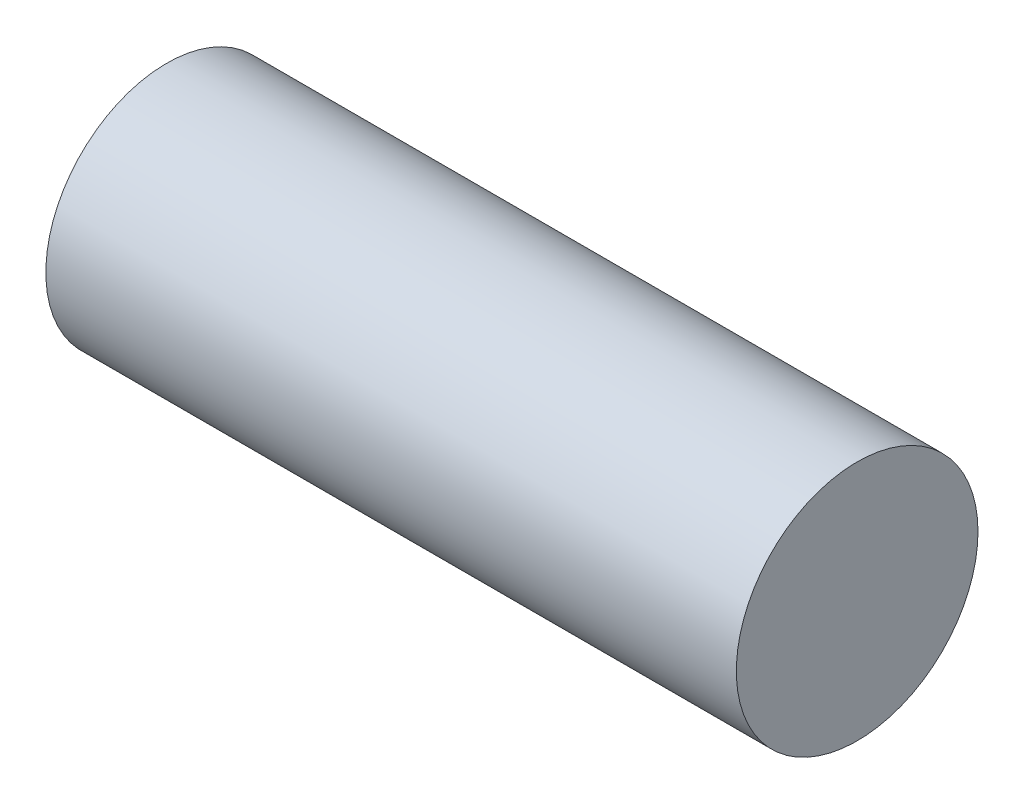
ISO-10303-21;
HEADER;
FILE_DESCRIPTION(('STEP AP214'),'2;1');
FILE_NAME('part.step','',(''),(''),'','','');
FILE_SCHEMA(('AUTOMOTIVE_DESIGN { 1 0 10303 214 1 1 1 1 }'));
ENDSEC;
DATA;
#1=APPLICATION_CONTEXT('core data for automotive mechanical design processes');
#2=APPLICATION_PROTOCOL_DEFINITION('international standard','automotive_design',2000,#1);
#3=PRODUCT_CONTEXT('',#1,'mechanical');
#4=PRODUCT('Part','Part','',(#3));
#5=PRODUCT_RELATED_PRODUCT_CATEGORY('part','',(#4));
#6=PRODUCT_DEFINITION_FORMATION('','',#4);
#7=PRODUCT_DEFINITION_CONTEXT('part definition',#1,'design');
#8=PRODUCT_DEFINITION('design','',#6,#7);
#9=PRODUCT_DEFINITION_SHAPE('','',#8);
#10=(LENGTH_UNIT() NAMED_UNIT(*) SI_UNIT(.MILLI.,.METRE.));
#11=(NAMED_UNIT(*) PLANE_ANGLE_UNIT() SI_UNIT($,.RADIAN.));
#12=(NAMED_UNIT(*) SI_UNIT($,.STERADIAN.) SOLID_ANGLE_UNIT());
#13=UNCERTAINTY_MEASURE_WITH_UNIT(LENGTH_MEASURE(1.E-05),#10,'distance_accuracy_value','');
#14=(GEOMETRIC_REPRESENTATION_CONTEXT(3) GLOBAL_UNCERTAINTY_ASSIGNED_CONTEXT((#13)) GLOBAL_UNIT_ASSIGNED_CONTEXT((#10,
#11,#12)) REPRESENTATION_CONTEXT('',''));
#15=CARTESIAN_POINT('',(0.,0.,0.));
#16=DIRECTION('',(0.,0.,1.));
#17=DIRECTION('',(1.,0.,0.));
#18=AXIS2_PLACEMENT_3D('',#15,#16,#17);
#19=CARTESIAN_POINT('',(1000.,-80.0000000000001,1640.));
#20=DIRECTION('',(-1.,0.,0.));
#21=DIRECTION('',(0.,0.,1.));
#22=AXIS2_PLACEMENT_3D('',#19,#20,#21);
#23=CYLINDRICAL_SURFACE('',#22,140.);
#24=CARTESIAN_POINT('',(1000.,-80.0000000000001,1640.));
#25=DIRECTION('',(1.,0.,0.));
#26=DIRECTION('',(0.,0.,-1.));
#27=AXIS2_PLACEMENT_3D('',#24,#25,#26);
#28=CIRCLE('',#27,140.);
#29=CARTESIAN_POINT('',(1000.,-80.0000000000001,1500.));
#30=VERTEX_POINT('',#29);
#31=EDGE_CURVE('E10',#30,#30,#28,.T.);
#32=ORIENTED_EDGE('',*,*,#31,.F.);
#33=EDGE_LOOP('',(#32));
#34=FACE_BOUND('',#33,.T.);
#35=CARTESIAN_POINT('',(200.,-80.0000000000001,1640.));
#36=DIRECTION('',(1.,0.,0.));
#37=DIRECTION('',(0.,0.,-1.));
#38=AXIS2_PLACEMENT_3D('',#35,#36,#37);
#39=CIRCLE('',#38,140.);
#40=CARTESIAN_POINT('',(200.,-80.0000000000001,1500.));
#41=VERTEX_POINT('',#40);
#42=EDGE_CURVE('E37',#41,#41,#39,.T.);
#43=ORIENTED_EDGE('',*,*,#42,.T.);
#44=EDGE_LOOP('',(#43));
#45=FACE_BOUND('',#44,.T.);
#46=ADVANCED_FACE('F40',(#34,#45),#23,.T.);
#47=CARTESIAN_POINT('',(1000.,-80.0000000000001,1640.));
#48=DIRECTION('',(1.,0.,0.));
#49=DIRECTION('',(0.,0.,-1.));
#50=AXIS2_PLACEMENT_3D('',#47,#48,#49);
#51=PLANE('',#50);
#52=ORIENTED_EDGE('',*,*,#31,.T.);
#53=EDGE_LOOP('',(#52));
#54=FACE_BOUND('',#53,.T.);
#55=ADVANCED_FACE('F55',(#54),#51,.T.);
#56=CARTESIAN_POINT('',(200.,-80.0000000000001,1640.));
#57=DIRECTION('',(1.,0.,0.));
#58=DIRECTION('',(0.,0.,-1.));
#59=AXIS2_PLACEMENT_3D('',#56,#57,#58);
#60=PLANE('',#59);
#61=ORIENTED_EDGE('',*,*,#42,.F.);
#62=EDGE_LOOP('',(#61));
#63=FACE_BOUND('',#62,.T.);
#64=ADVANCED_FACE('F49',(#63),#60,.F.);
#65=CLOSED_SHELL('',(#46,#55,#64));
#66=MANIFOLD_SOLID_BREP('B2',#65);
#67=ADVANCED_BREP_SHAPE_REPRESENTATION('',(#18,#66),#14);
#68=SHAPE_DEFINITION_REPRESENTATION(#9,#67);
ENDSEC;
END-ISO-10303-21;
